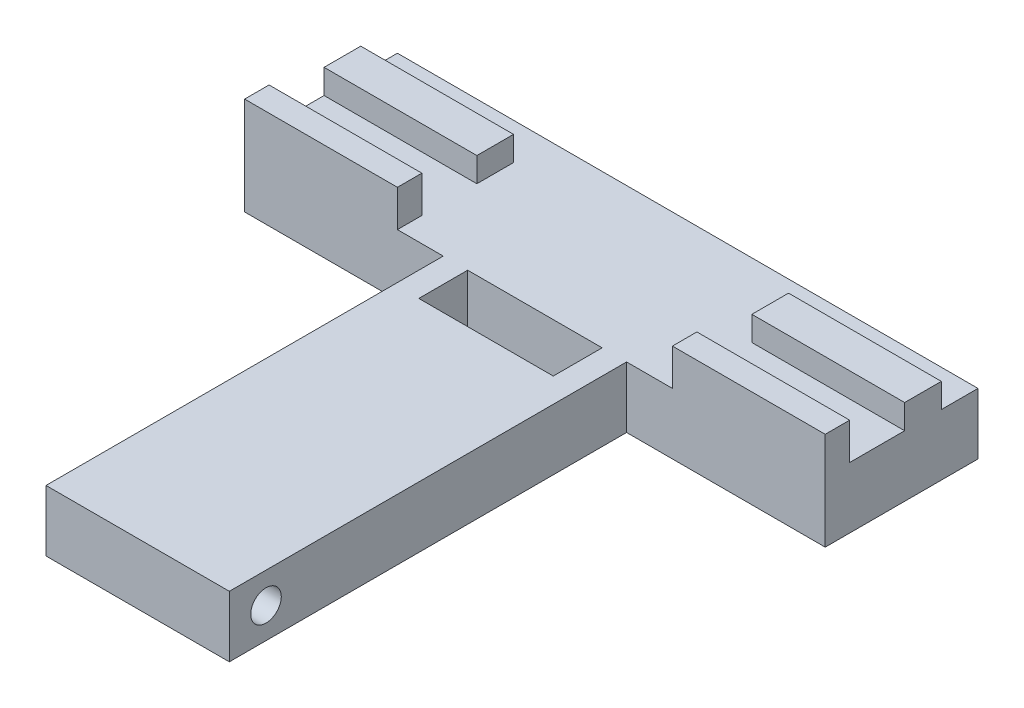
ISO-10303-21;
HEADER;
FILE_DESCRIPTION(('STEP AP214'),'2;1');
FILE_NAME('part.step','',(''),(''),'','','');
FILE_SCHEMA(('AUTOMOTIVE_DESIGN { 1 0 10303 214 1 1 1 1 }'));
ENDSEC;
DATA;
#1=APPLICATION_CONTEXT('core data for automotive mechanical design processes');
#2=APPLICATION_PROTOCOL_DEFINITION('international standard','automotive_design',2000,#1);
#3=PRODUCT_CONTEXT('',#1,'mechanical');
#4=PRODUCT('Part','Part','',(#3));
#5=PRODUCT_RELATED_PRODUCT_CATEGORY('part','',(#4));
#6=PRODUCT_DEFINITION_FORMATION('','',#4);
#7=PRODUCT_DEFINITION_CONTEXT('part definition',#1,'design');
#8=PRODUCT_DEFINITION('design','',#6,#7);
#9=PRODUCT_DEFINITION_SHAPE('','',#8);
#10=(LENGTH_UNIT() NAMED_UNIT(*) SI_UNIT(.MILLI.,.METRE.));
#11=(NAMED_UNIT(*) PLANE_ANGLE_UNIT() SI_UNIT($,.RADIAN.));
#12=(NAMED_UNIT(*) SI_UNIT($,.STERADIAN.) SOLID_ANGLE_UNIT());
#13=UNCERTAINTY_MEASURE_WITH_UNIT(LENGTH_MEASURE(1.E-05),#10,'distance_accuracy_value','');
#14=(GEOMETRIC_REPRESENTATION_CONTEXT(3) GLOBAL_UNCERTAINTY_ASSIGNED_CONTEXT((#13)) GLOBAL_UNIT_ASSIGNED_CONTEXT((#10,
#11,#12)) REPRESENTATION_CONTEXT('',''));
#15=CARTESIAN_POINT('',(0.,0.,0.));
#16=DIRECTION('',(0.,0.,1.));
#17=DIRECTION('',(1.,0.,0.));
#18=AXIS2_PLACEMENT_3D('',#15,#16,#17);
#19=CARTESIAN_POINT('',(2.,5.,-32.5));
#20=DIRECTION('',(0.,0.,-1.));
#21=DIRECTION('',(-1.,0.,0.));
#22=AXIS2_PLACEMENT_3D('',#19,#20,#21);
#23=PLANE('',#22);
#24=DIRECTION('',(1.,0.,0.));
#25=VECTOR('',#24,1.);
#26=CARTESIAN_POINT('',(-16.25,8.,-32.5));
#27=LINE('',#26,#25);
#28=CARTESIAN_POINT('',(18.75,8.,-32.5));
#29=VERTEX_POINT('',#28);
#30=CARTESIAN_POINT('',(31.25,8.,-32.5));
#31=VERTEX_POINT('',#30);
#32=EDGE_CURVE('E242',#29,#31,#27,.T.);
#33=ORIENTED_EDGE('',*,*,#32,.F.);
#34=DIRECTION('',(0.,1.,0.));
#35=VECTOR('',#34,1.);
#36=CARTESIAN_POINT('',(18.75,8.,-32.5));
#37=LINE('',#36,#35);
#38=CARTESIAN_POINT('',(18.75,5.,-32.5));
#39=VERTEX_POINT('',#38);
#40=EDGE_CURVE('E215',#39,#29,#37,.T.);
#41=ORIENTED_EDGE('',*,*,#40,.F.);
#42=DIRECTION('',(1.,0.,0.));
#43=VECTOR('',#42,1.);
#44=CARTESIAN_POINT('',(18.75,5.,-32.5));
#45=LINE('',#44,#43);
#46=CARTESIAN_POINT('',(15.,5.,-32.5));
#47=VERTEX_POINT('',#46);
#48=EDGE_CURVE('E224',#47,#39,#45,.T.);
#49=ORIENTED_EDGE('',*,*,#48,.F.);
#50=DIRECTION('',(0.,1.,0.));
#51=VECTOR('',#50,1.);
#52=CARTESIAN_POINT('',(15.,5.00000000000006,-32.5));
#53=LINE('',#52,#51);
#54=CARTESIAN_POINT('',(15.,0.,-32.5));
#55=VERTEX_POINT('',#54);
#56=EDGE_CURVE('E289',#55,#47,#53,.T.);
#57=ORIENTED_EDGE('',*,*,#56,.F.);
#58=DIRECTION('',(1.,0.,0.));
#59=VECTOR('',#58,1.);
#60=CARTESIAN_POINT('',(-16.25,0.,-32.5));
#61=LINE('',#60,#59);
#62=CARTESIAN_POINT('',(31.25,0.,-32.5));
#63=VERTEX_POINT('',#62);
#64=EDGE_CURVE('E290',#55,#63,#61,.T.);
#65=ORIENTED_EDGE('',*,*,#64,.T.);
#66=DIRECTION('',(0.,-1.,0.));
#67=VECTOR('',#66,1.);
#68=CARTESIAN_POINT('',(31.25,8.,-32.5));
#69=LINE('',#68,#67);
#70=EDGE_CURVE('E274',#31,#63,#69,.T.);
#71=ORIENTED_EDGE('',*,*,#70,.F.);
#72=EDGE_LOOP('',(#33,#41,#49,#57,#65,#71));
#73=FACE_BOUND('',#72,.T.);
#74=ADVANCED_FACE('F33',(#73),#23,.F.);
#75=DIRECTION('',(0.,-1.,0.));
#76=VECTOR('',#75,1.);
#77=CARTESIAN_POINT('',(13.,5.,-32.5));
#78=LINE('',#77,#76);
#79=CARTESIAN_POINT('',(13.,5.,-32.5));
#80=VERTEX_POINT('',#79);
#81=CARTESIAN_POINT('',(13.,0.,-32.5));
#82=VERTEX_POINT('',#81);
#83=EDGE_CURVE('E341',#80,#82,#78,.T.);
#84=ORIENTED_EDGE('',*,*,#83,.F.);
#85=CARTESIAN_POINT('',(2.00000000000001,5.,-32.5));
#86=VERTEX_POINT('',#85);
#87=EDGE_CURVE('E230',#86,#80,#45,.T.);
#88=ORIENTED_EDGE('',*,*,#87,.F.);
#89=DIRECTION('',(0.,-1.,0.));
#90=VECTOR('',#89,1.);
#91=CARTESIAN_POINT('',(2.,5.,-32.5));
#92=LINE('',#91,#90);
#93=CARTESIAN_POINT('',(2.,0.,-32.5));
#94=VERTEX_POINT('',#93);
#95=EDGE_CURVE('E345',#86,#94,#92,.T.);
#96=ORIENTED_EDGE('',*,*,#95,.T.);
#97=DIRECTION('',(-1.,0.,0.));
#98=VECTOR('',#97,1.);
#99=CARTESIAN_POINT('',(0.,0.,-32.5));
#100=LINE('',#99,#98);
#101=EDGE_CURVE('E402',#82,#94,#100,.T.);
#102=ORIENTED_EDGE('',*,*,#101,.F.);
#103=EDGE_LOOP('',(#84,#88,#96,#102));
#104=FACE_BOUND('',#103,.T.);
#105=ADVANCED_FACE('F470',(#104),#23,.F.);
#106=CARTESIAN_POINT('',(-16.25,7.,-39.));
#107=DIRECTION('',(0.,0.,1.));
#108=DIRECTION('',(1.,0.,0.));
#109=AXIS2_PLACEMENT_3D('',#106,#107,#108);
#110=PLANE('',#109);
#111=DIRECTION('',(0.,-1.,0.));
#112=VECTOR('',#111,1.);
#113=CARTESIAN_POINT('',(-3.75000000000001,7.,-39.));
#114=LINE('',#113,#112);
#115=CARTESIAN_POINT('',(-3.75000000000001,7.,-39.));
#116=VERTEX_POINT('',#115);
#117=CARTESIAN_POINT('',(-3.75000000000001,5.,-39.));
#118=VERTEX_POINT('',#117);
#119=EDGE_CURVE('E267',#116,#118,#114,.T.);
#120=ORIENTED_EDGE('',*,*,#119,.F.);
#121=DIRECTION('',(1.,0.,0.));
#122=VECTOR('',#121,1.);
#123=CARTESIAN_POINT('',(-16.25,7.,-39.));
#124=LINE('',#123,#122);
#125=CARTESIAN_POINT('',(-16.25,7.,-39.));
#126=VERTEX_POINT('',#125);
#127=EDGE_CURVE('E316',#126,#116,#124,.T.);
#128=ORIENTED_EDGE('',*,*,#127,.F.);
#129=DIRECTION('',(0.,-1.,0.));
#130=VECTOR('',#129,1.);
#131=CARTESIAN_POINT('',(-16.25,7.,-39.));
#132=LINE('',#131,#130);
#133=CARTESIAN_POINT('',(-16.25,5.,-39.));
#134=VERTEX_POINT('',#133);
#135=EDGE_CURVE('E299',#126,#134,#132,.T.);
#136=ORIENTED_EDGE('',*,*,#135,.T.);
#137=DIRECTION('',(1.,0.,0.));
#138=VECTOR('',#137,1.);
#139=CARTESIAN_POINT('',(-16.25,5.,-39.));
#140=LINE('',#139,#138);
#141=EDGE_CURVE('E329',#134,#118,#140,.T.);
#142=ORIENTED_EDGE('',*,*,#141,.T.);
#143=EDGE_LOOP('',(#120,#128,#136,#142));
#144=FACE_BOUND('',#143,.T.);
#145=ADVANCED_FACE('F455',(#144),#110,.T.);
#146=CARTESIAN_POINT('',(-16.25,7.,-42.));
#147=DIRECTION('',(0.,1.,0.));
#148=DIRECTION('',(0.,0.,1.));
#149=AXIS2_PLACEMENT_3D('',#146,#147,#148);
#150=PLANE('',#149);
#151=DIRECTION('',(0.,0.,1.));
#152=VECTOR('',#151,1.);
#153=CARTESIAN_POINT('',(-3.75000000000001,7.,-42.));
#154=LINE('',#153,#152);
#155=CARTESIAN_POINT('',(-3.75000000000001,7.,-42.));
#156=VERTEX_POINT('',#155);
#157=EDGE_CURVE('E265',#156,#116,#154,.T.);
#158=ORIENTED_EDGE('',*,*,#157,.F.);
#159=DIRECTION('',(1.,0.,0.));
#160=VECTOR('',#159,1.);
#161=CARTESIAN_POINT('',(-16.25,7.,-42.));
#162=LINE('',#161,#160);
#163=CARTESIAN_POINT('',(-16.25,7.,-42.));
#164=VERTEX_POINT('',#163);
#165=EDGE_CURVE('E321',#164,#156,#162,.T.);
#166=ORIENTED_EDGE('',*,*,#165,.F.);
#167=DIRECTION('',(0.,0.,1.));
#168=VECTOR('',#167,1.);
#169=CARTESIAN_POINT('',(-16.25,7.,-42.));
#170=LINE('',#169,#168);
#171=EDGE_CURVE('E305',#164,#126,#170,.T.);
#172=ORIENTED_EDGE('',*,*,#171,.T.);
#173=ORIENTED_EDGE('',*,*,#127,.T.);
#174=EDGE_LOOP('',(#158,#166,#172,#173));
#175=FACE_BOUND('',#174,.T.);
#176=ADVANCED_FACE('F459',(#175),#150,.T.);
#177=CARTESIAN_POINT('',(-16.25,7.,-42.));
#178=DIRECTION('',(0.,0.,-1.));
#179=DIRECTION('',(-1.,0.,0.));
#180=AXIS2_PLACEMENT_3D('',#177,#178,#179);
#181=PLANE('',#180);
#182=DIRECTION('',(0.,1.,0.));
#183=VECTOR('',#182,1.);
#184=CARTESIAN_POINT('',(-3.75000000000001,7.,-42.));
#185=LINE('',#184,#183);
#186=CARTESIAN_POINT('',(-3.75000000000001,5.,-42.));
#187=VERTEX_POINT('',#186);
#188=EDGE_CURVE('E263',#187,#156,#185,.T.);
#189=ORIENTED_EDGE('',*,*,#188,.F.);
#190=DIRECTION('',(1.,0.,0.));
#191=VECTOR('',#190,1.);
#192=CARTESIAN_POINT('',(-16.25,5.,-42.));
#193=LINE('',#192,#191);
#194=CARTESIAN_POINT('',(-16.25,5.,-42.));
#195=VERTEX_POINT('',#194);
#196=EDGE_CURVE('E325',#195,#187,#193,.T.);
#197=ORIENTED_EDGE('',*,*,#196,.F.);
#198=DIRECTION('',(0.,1.,0.));
#199=VECTOR('',#198,1.);
#200=CARTESIAN_POINT('',(-16.25,7.,-42.));
#201=LINE('',#200,#199);
#202=EDGE_CURVE('E301',#195,#164,#201,.T.);
#203=ORIENTED_EDGE('',*,*,#202,.T.);
#204=ORIENTED_EDGE('',*,*,#165,.T.);
#205=EDGE_LOOP('',(#189,#197,#203,#204));
#206=FACE_BOUND('',#205,.T.);
#207=ADVANCED_FACE('F448',(#206),#181,.T.);
#208=CARTESIAN_POINT('',(-16.25,8.,-34.5));
#209=DIRECTION('',(0.,1.,0.));
#210=DIRECTION('',(0.,0.,1.));
#211=AXIS2_PLACEMENT_3D('',#208,#209,#210);
#212=PLANE('',#211);
#213=DIRECTION('',(0.,0.,1.));
#214=VECTOR('',#213,1.);
#215=CARTESIAN_POINT('',(-3.75000000000001,8.,-81.));
#216=LINE('',#215,#214);
#217=CARTESIAN_POINT('',(-3.75000000000001,8.,-34.5));
#218=VERTEX_POINT('',#217);
#219=CARTESIAN_POINT('',(-3.75000000000001,8.,-32.5));
#220=VERTEX_POINT('',#219);
#221=EDGE_CURVE('E221',#218,#220,#216,.T.);
#222=ORIENTED_EDGE('',*,*,#221,.F.);
#223=DIRECTION('',(1.,0.,0.));
#224=VECTOR('',#223,1.);
#225=CARTESIAN_POINT('',(-16.25,8.,-34.5));
#226=LINE('',#225,#224);
#227=CARTESIAN_POINT('',(-16.25,8.,-34.5));
#228=VERTEX_POINT('',#227);
#229=EDGE_CURVE('E293',#228,#218,#226,.T.);
#230=ORIENTED_EDGE('',*,*,#229,.F.);
#231=DIRECTION('',(0.,0.,1.));
#232=VECTOR('',#231,1.);
#233=CARTESIAN_POINT('',(-16.25,8.,-34.5));
#234=LINE('',#233,#232);
#235=CARTESIAN_POINT('',(-16.25,8.,-32.5));
#236=VERTEX_POINT('',#235);
#237=EDGE_CURVE('E273',#228,#236,#234,.T.);
#238=ORIENTED_EDGE('',*,*,#237,.T.);
#239=EDGE_CURVE('E291',#236,#220,#27,.T.);
#240=ORIENTED_EDGE('',*,*,#239,.T.);
#241=EDGE_LOOP('',(#222,#230,#238,#240));
#242=FACE_BOUND('',#241,.T.);
#243=ADVANCED_FACE('F534',(#242),#212,.T.);
#244=CARTESIAN_POINT('',(-16.25,5.,-34.5));
#245=DIRECTION('',(0.,0.,-1.));
#246=DIRECTION('',(-1.,0.,0.));
#247=AXIS2_PLACEMENT_3D('',#244,#245,#246);
#248=PLANE('',#247);
#249=DIRECTION('',(0.,1.,0.));
#250=VECTOR('',#249,1.);
#251=CARTESIAN_POINT('',(-3.75000000000001,5.,-34.5));
#252=LINE('',#251,#250);
#253=CARTESIAN_POINT('',(-3.75000000000001,5.,-34.5));
#254=VERTEX_POINT('',#253);
#255=EDGE_CURVE('E11',#254,#218,#252,.T.);
#256=ORIENTED_EDGE('',*,*,#255,.F.);
#257=DIRECTION('',(-1.,0.,0.));
#258=VECTOR('',#257,1.);
#259=CARTESIAN_POINT('',(0.,5.,-34.5));
#260=LINE('',#259,#258);
#261=CARTESIAN_POINT('',(-16.25,5.,-34.5));
#262=VERTEX_POINT('',#261);
#263=EDGE_CURVE('E211',#254,#262,#260,.T.);
#264=ORIENTED_EDGE('',*,*,#263,.T.);
#265=DIRECTION('',(0.,1.,0.));
#266=VECTOR('',#265,1.);
#267=CARTESIAN_POINT('',(-16.25,5.,-34.5));
#268=LINE('',#267,#266);
#269=EDGE_CURVE('E270',#262,#228,#268,.T.);
#270=ORIENTED_EDGE('',*,*,#269,.T.);
#271=ORIENTED_EDGE('',*,*,#229,.T.);
#272=EDGE_LOOP('',(#256,#264,#270,#271));
#273=FACE_BOUND('',#272,.T.);
#274=ADVANCED_FACE('F518',(#273),#248,.T.);
#275=CARTESIAN_POINT('',(0.,5.,-35.));
#276=DIRECTION('',(1.,0.,0.));
#277=DIRECTION('',(0.,0.,-1.));
#278=AXIS2_PLACEMENT_3D('',#275,#276,#277);
#279=PLANE('',#278);
#280=CARTESIAN_POINT('',(0.,2.5,-3.00000000000001));
#281=DIRECTION('',(1.,0.,0.));
#282=DIRECTION('',(0.,0.,-1.));
#283=AXIS2_PLACEMENT_3D('',#280,#281,#282);
#284=CIRCLE('',#283,1.25);
#285=CARTESIAN_POINT('',(0.,2.5,-4.25000000000001));
#286=VERTEX_POINT('',#285);
#287=EDGE_CURVE('E354',#286,#286,#284,.T.);
#288=ORIENTED_EDGE('',*,*,#287,.T.);
#289=EDGE_LOOP('',(#288));
#290=FACE_BOUND('',#289,.T.);
#291=DIRECTION('',(0.,0.,1.));
#292=VECTOR('',#291,1.);
#293=CARTESIAN_POINT('',(0.,5.,-35.));
#294=LINE('',#293,#292);
#295=CARTESIAN_POINT('',(0.,5.,-32.5));
#296=VERTEX_POINT('',#295);
#297=CARTESIAN_POINT('',(0.,5.,0.));
#298=VERTEX_POINT('',#297);
#299=EDGE_CURVE('E358',#296,#298,#294,.T.);
#300=ORIENTED_EDGE('',*,*,#299,.F.);
#301=DIRECTION('',(0.,-1.,0.));
#302=VECTOR('',#301,1.);
#303=CARTESIAN_POINT('',(0.,5.,-32.5));
#304=LINE('',#303,#302);
#305=CARTESIAN_POINT('',(0.,0.,-32.5));
#306=VERTEX_POINT('',#305);
#307=EDGE_CURVE('E229',#296,#306,#304,.T.);
#308=ORIENTED_EDGE('',*,*,#307,.T.);
#309=DIRECTION('',(0.,0.,1.));
#310=VECTOR('',#309,1.);
#311=CARTESIAN_POINT('',(0.,0.,-35.));
#312=LINE('',#311,#310);
#313=CARTESIAN_POINT('',(0.,0.,0.));
#314=VERTEX_POINT('',#313);
#315=EDGE_CURVE('E357',#306,#314,#312,.T.);
#316=ORIENTED_EDGE('',*,*,#315,.T.);
#317=DIRECTION('',(0.,-1.,0.));
#318=VECTOR('',#317,1.);
#319=CARTESIAN_POINT('',(0.,5.,0.));
#320=LINE('',#319,#318);
#321=EDGE_CURVE('E393',#298,#314,#320,.T.);
#322=ORIENTED_EDGE('',*,*,#321,.F.);
#323=EDGE_LOOP('',(#300,#308,#316,#322));
#324=FACE_BOUND('',#323,.T.);
#325=ADVANCED_FACE('F35',(#290,#324),#279,.F.);
#326=CARTESIAN_POINT('',(0.,5.,0.));
#327=DIRECTION('',(0.,0.,-1.));
#328=DIRECTION('',(-1.,0.,0.));
#329=AXIS2_PLACEMENT_3D('',#326,#327,#328);
#330=PLANE('',#329);
#331=DIRECTION('',(1.,0.,0.));
#332=VECTOR('',#331,1.);
#333=CARTESIAN_POINT('',(0.,0.,0.));
#334=LINE('',#333,#332);
#335=CARTESIAN_POINT('',(15.,0.,0.));
#336=VERTEX_POINT('',#335);
#337=EDGE_CURVE('E376',#314,#336,#334,.T.);
#338=ORIENTED_EDGE('',*,*,#337,.T.);
#339=DIRECTION('',(0.,-1.,0.));
#340=VECTOR('',#339,1.);
#341=CARTESIAN_POINT('',(15.,5.,0.));
#342=LINE('',#341,#340);
#343=CARTESIAN_POINT('',(15.,5.,0.));
#344=VERTEX_POINT('',#343);
#345=EDGE_CURVE('E390',#344,#336,#342,.T.);
#346=ORIENTED_EDGE('',*,*,#345,.F.);
#347=DIRECTION('',(1.,0.,0.));
#348=VECTOR('',#347,1.);
#349=CARTESIAN_POINT('',(0.,5.,0.));
#350=LINE('',#349,#348);
#351=EDGE_CURVE('E360',#298,#344,#350,.T.);
#352=ORIENTED_EDGE('',*,*,#351,.F.);
#353=ORIENTED_EDGE('',*,*,#321,.T.);
#354=EDGE_LOOP('',(#338,#346,#352,#353));
#355=FACE_BOUND('',#354,.T.);
#356=ADVANCED_FACE('F511',(#355),#330,.F.);
#357=CARTESIAN_POINT('',(15.,5.,0.));
#358=DIRECTION('',(-1.,0.,0.));
#359=DIRECTION('',(0.,0.,1.));
#360=AXIS2_PLACEMENT_3D('',#357,#358,#359);
#361=PLANE('',#360);
#362=CARTESIAN_POINT('',(15.,2.5,-3.00000000000001));
#363=DIRECTION('',(1.,0.,0.));
#364=DIRECTION('',(0.,0.,-1.));
#365=AXIS2_PLACEMENT_3D('',#362,#363,#364);
#366=CIRCLE('',#365,1.25);
#367=CARTESIAN_POINT('',(15.,2.5,-4.25000000000001));
#368=VERTEX_POINT('',#367);
#369=EDGE_CURVE('E344',#368,#368,#366,.T.);
#370=ORIENTED_EDGE('',*,*,#369,.F.);
#371=EDGE_LOOP('',(#370));
#372=FACE_BOUND('',#371,.T.);
#373=DIRECTION('',(0.,0.,-1.));
#374=VECTOR('',#373,1.);
#375=CARTESIAN_POINT('',(15.,0.,0.));
#376=LINE('',#375,#374);
#377=EDGE_CURVE('E378',#336,#55,#376,.T.);
#378=ORIENTED_EDGE('',*,*,#377,.T.);
#379=ORIENTED_EDGE('',*,*,#56,.T.);
#380=DIRECTION('',(0.,0.,-1.));
#381=VECTOR('',#380,1.);
#382=CARTESIAN_POINT('',(15.,5.,0.));
#383=LINE('',#382,#381);
#384=EDGE_CURVE('E236',#344,#47,#383,.T.);
#385=ORIENTED_EDGE('',*,*,#384,.F.);
#386=ORIENTED_EDGE('',*,*,#345,.T.);
#387=EDGE_LOOP('',(#378,#379,#385,#386));
#388=FACE_BOUND('',#387,.T.);
#389=ADVANCED_FACE('F509',(#372,#388),#361,.F.);
#390=CARTESIAN_POINT('',(31.25,5.,-45.));
#391=DIRECTION('',(-1.,0.,0.));
#392=DIRECTION('',(0.,0.,1.));
#393=AXIS2_PLACEMENT_3D('',#390,#391,#392);
#394=PLANE('',#393);
#395=DIRECTION('',(0.,0.,-1.));
#396=VECTOR('',#395,1.);
#397=CARTESIAN_POINT('',(31.25,0.,-45.));
#398=LINE('',#397,#396);
#399=CARTESIAN_POINT('',(31.25,0.,-45.));
#400=VERTEX_POINT('',#399);
#401=EDGE_CURVE('E380',#63,#400,#398,.T.);
#402=ORIENTED_EDGE('',*,*,#401,.T.);
#403=DIRECTION('',(0.,-1.,0.));
#404=VECTOR('',#403,1.);
#405=CARTESIAN_POINT('',(31.25,5.,-45.));
#406=LINE('',#405,#404);
#407=CARTESIAN_POINT('',(31.25,5.,-45.));
#408=VERTEX_POINT('',#407);
#409=EDGE_CURVE('E387',#408,#400,#406,.T.);
#410=ORIENTED_EDGE('',*,*,#409,.F.);
#411=DIRECTION('',(0.,0.,-1.));
#412=VECTOR('',#411,1.);
#413=CARTESIAN_POINT('',(31.25,5.,-45.));
#414=LINE('',#413,#412);
#415=CARTESIAN_POINT('',(31.25,5.,-42.));
#416=VERTEX_POINT('',#415);
#417=EDGE_CURVE('E364',#416,#408,#414,.T.);
#418=ORIENTED_EDGE('',*,*,#417,.F.);
#419=DIRECTION('',(0.,1.,0.));
#420=VECTOR('',#419,1.);
#421=CARTESIAN_POINT('',(31.25,7.,-42.));
#422=LINE('',#421,#420);
#423=CARTESIAN_POINT('',(31.25,7.,-42.));
#424=VERTEX_POINT('',#423);
#425=EDGE_CURVE('E311',#416,#424,#422,.T.);
#426=ORIENTED_EDGE('',*,*,#425,.T.);
#427=DIRECTION('',(0.,0.,1.));
#428=VECTOR('',#427,1.);
#429=CARTESIAN_POINT('',(31.25,7.,-42.));
#430=LINE('',#429,#428);
#431=CARTESIAN_POINT('',(31.25,7.,-39.));
#432=VERTEX_POINT('',#431);
#433=EDGE_CURVE('E302',#424,#432,#430,.T.);
#434=ORIENTED_EDGE('',*,*,#433,.T.);
#435=DIRECTION('',(0.,-1.,0.));
#436=VECTOR('',#435,1.);
#437=CARTESIAN_POINT('',(31.25,7.,-39.));
#438=LINE('',#437,#436);
#439=CARTESIAN_POINT('',(31.25,5.,-39.));
#440=VERTEX_POINT('',#439);
#441=EDGE_CURVE('E298',#432,#440,#438,.T.);
#442=ORIENTED_EDGE('',*,*,#441,.T.);
#443=CARTESIAN_POINT('',(31.25,5.,-34.5));
#444=VERTEX_POINT('',#443);
#445=EDGE_CURVE('E365',#444,#440,#414,.T.);
#446=ORIENTED_EDGE('',*,*,#445,.F.);
#447=DIRECTION('',(0.,1.,0.));
#448=VECTOR('',#447,1.);
#449=CARTESIAN_POINT('',(31.25,5.,-34.5));
#450=LINE('',#449,#448);
#451=CARTESIAN_POINT('',(31.25,8.,-34.5));
#452=VERTEX_POINT('',#451);
#453=EDGE_CURVE('E269',#444,#452,#450,.T.);
#454=ORIENTED_EDGE('',*,*,#453,.T.);
#455=DIRECTION('',(0.,0.,1.));
#456=VECTOR('',#455,1.);
#457=CARTESIAN_POINT('',(31.25,8.,-34.5));
#458=LINE('',#457,#456);
#459=EDGE_CURVE('E282',#452,#31,#458,.T.);
#460=ORIENTED_EDGE('',*,*,#459,.T.);
#461=ORIENTED_EDGE('',*,*,#70,.T.);
#462=EDGE_LOOP('',(#402,#410,#418,#426,#434,#442,#446,#454,#460,#461));
#463=FACE_BOUND('',#462,.T.);
#464=ADVANCED_FACE('F414',(#463),#394,.F.);
#465=CARTESIAN_POINT('',(-16.25,5.,-45.));
#466=DIRECTION('',(0.,0.,1.));
#467=DIRECTION('',(1.,0.,0.));
#468=AXIS2_PLACEMENT_3D('',#465,#466,#467);
#469=PLANE('',#468);
#470=DIRECTION('',(-1.,0.,0.));
#471=VECTOR('',#470,1.);
#472=CARTESIAN_POINT('',(-16.25,0.,-45.));
#473=LINE('',#472,#471);
#474=CARTESIAN_POINT('',(-16.25,0.,-45.));
#475=VERTEX_POINT('',#474);
#476=EDGE_CURVE('E382',#400,#475,#473,.T.);
#477=ORIENTED_EDGE('',*,*,#476,.T.);
#478=DIRECTION('',(0.,-1.,0.));
#479=VECTOR('',#478,1.);
#480=CARTESIAN_POINT('',(-16.25,5.,-45.));
#481=LINE('',#480,#479);
#482=CARTESIAN_POINT('',(-16.25,5.,-45.));
#483=VERTEX_POINT('',#482);
#484=EDGE_CURVE('E374',#483,#475,#481,.T.);
#485=ORIENTED_EDGE('',*,*,#484,.F.);
#486=DIRECTION('',(-1.,0.,0.));
#487=VECTOR('',#486,1.);
#488=CARTESIAN_POINT('',(-16.25,5.,-45.));
#489=LINE('',#488,#487);
#490=EDGE_CURVE('E368',#408,#483,#489,.T.);
#491=ORIENTED_EDGE('',*,*,#490,.F.);
#492=ORIENTED_EDGE('',*,*,#409,.T.);
#493=EDGE_LOOP('',(#477,#485,#491,#492));
#494=FACE_BOUND('',#493,.T.);
#495=ADVANCED_FACE('F438',(#494),#469,.F.);
#496=CARTESIAN_POINT('',(-16.25,5.,-35.));
#497=DIRECTION('',(1.,0.,0.));
#498=DIRECTION('',(0.,0.,-1.));
#499=AXIS2_PLACEMENT_3D('',#496,#497,#498);
#500=PLANE('',#499);
#501=DIRECTION('',(0.,0.,1.));
#502=VECTOR('',#501,1.);
#503=CARTESIAN_POINT('',(-16.25,0.,-35.));
#504=LINE('',#503,#502);
#505=CARTESIAN_POINT('',(-16.25,0.,-32.5));
#506=VERTEX_POINT('',#505);
#507=EDGE_CURVE('E361',#475,#506,#504,.T.);
#508=ORIENTED_EDGE('',*,*,#507,.T.);
#509=DIRECTION('',(0.,-1.,0.));
#510=VECTOR('',#509,1.);
#511=CARTESIAN_POINT('',(-16.25,8.,-32.5));
#512=LINE('',#511,#510);
#513=EDGE_CURVE('E277',#236,#506,#512,.T.);
#514=ORIENTED_EDGE('',*,*,#513,.F.);
#515=ORIENTED_EDGE('',*,*,#237,.F.);
#516=ORIENTED_EDGE('',*,*,#269,.F.);
#517=DIRECTION('',(0.,0.,1.));
#518=VECTOR('',#517,1.);
#519=CARTESIAN_POINT('',(-16.25,5.,-35.));
#520=LINE('',#519,#518);
#521=EDGE_CURVE('E370',#134,#262,#520,.T.);
#522=ORIENTED_EDGE('',*,*,#521,.F.);
#523=ORIENTED_EDGE('',*,*,#135,.F.);
#524=ORIENTED_EDGE('',*,*,#171,.F.);
#525=ORIENTED_EDGE('',*,*,#202,.F.);
#526=EDGE_CURVE('E371',#483,#195,#520,.T.);
#527=ORIENTED_EDGE('',*,*,#526,.F.);
#528=ORIENTED_EDGE('',*,*,#484,.T.);
#529=EDGE_LOOP('',(#508,#514,#515,#516,#522,#523,#524,#525,#527,#528));
#530=FACE_BOUND('',#529,.T.);
#531=ADVANCED_FACE('F443',(#530),#500,.F.);
#532=CARTESIAN_POINT('',(0.,5.,0.));
#533=DIRECTION('',(0.,1.,0.));
#534=DIRECTION('',(0.,0.,1.));
#535=AXIS2_PLACEMENT_3D('',#532,#533,#534);
#536=PLANE('',#535);
#537=CARTESIAN_POINT('',(18.75,5.,-39.));
#538=VERTEX_POINT('',#537);
#539=EDGE_CURVE('E308',#538,#440,#140,.T.);
#540=ORIENTED_EDGE('',*,*,#539,.F.);
#541=DIRECTION('',(0.,0.,1.));
#542=VECTOR('',#541,1.);
#543=CARTESIAN_POINT('',(18.75,5.,-81.));
#544=LINE('',#543,#542);
#545=CARTESIAN_POINT('',(18.75,5.,-42.));
#546=VERTEX_POINT('',#545);
#547=EDGE_CURVE('E48',#546,#538,#544,.T.);
#548=ORIENTED_EDGE('',*,*,#547,.F.);
#549=EDGE_CURVE('E328',#546,#416,#193,.T.);
#550=ORIENTED_EDGE('',*,*,#549,.T.);
#551=ORIENTED_EDGE('',*,*,#417,.T.);
#552=ORIENTED_EDGE('',*,*,#490,.T.);
#553=ORIENTED_EDGE('',*,*,#526,.T.);
#554=ORIENTED_EDGE('',*,*,#196,.T.);
#555=DIRECTION('',(0.,0.,1.));
#556=VECTOR('',#555,1.);
#557=CARTESIAN_POINT('',(-3.75000000000001,5.,-81.));
#558=LINE('',#557,#556);
#559=EDGE_CURVE('E214',#187,#118,#558,.T.);
#560=ORIENTED_EDGE('',*,*,#559,.T.);
#561=ORIENTED_EDGE('',*,*,#141,.F.);
#562=ORIENTED_EDGE('',*,*,#521,.T.);
#563=ORIENTED_EDGE('',*,*,#263,.F.);
#564=CARTESIAN_POINT('',(-3.75000000000001,5.,-32.5));
#565=VERTEX_POINT('',#564);
#566=EDGE_CURVE('E203',#254,#565,#558,.T.);
#567=ORIENTED_EDGE('',*,*,#566,.T.);
#568=EDGE_CURVE('E208',#565,#296,#45,.T.);
#569=ORIENTED_EDGE('',*,*,#568,.T.);
#570=ORIENTED_EDGE('',*,*,#299,.T.);
#571=ORIENTED_EDGE('',*,*,#351,.T.);
#572=ORIENTED_EDGE('',*,*,#384,.T.);
#573=ORIENTED_EDGE('',*,*,#48,.T.);
#574=CARTESIAN_POINT('',(18.75,5.,-34.5));
#575=VERTEX_POINT('',#574);
#576=EDGE_CURVE('E55',#575,#39,#544,.T.);
#577=ORIENTED_EDGE('',*,*,#576,.F.);
#578=EDGE_CURVE('E408',#444,#575,#260,.T.);
#579=ORIENTED_EDGE('',*,*,#578,.F.);
#580=ORIENTED_EDGE('',*,*,#445,.T.);
#581=EDGE_LOOP('',(#540,#548,#550,#551,#552,#553,#554,#560,#561,#562,#563,#567,#569,#570,#571,
#572,#573,#577,#579,#580));
#582=FACE_BOUND('',#581,.T.);
#583=DIRECTION('',(0.,0.,-1.));
#584=VECTOR('',#583,1.);
#585=CARTESIAN_POINT('',(2.,5.,-28.5));
#586=LINE('',#585,#584);
#587=CARTESIAN_POINT('',(2.,5.,-28.5));
#588=VERTEX_POINT('',#587);
#589=EDGE_CURVE('E337',#588,#86,#586,.T.);
#590=ORIENTED_EDGE('',*,*,#589,.T.);
#591=ORIENTED_EDGE('',*,*,#87,.T.);
#592=DIRECTION('',(0.,0.,1.));
#593=VECTOR('',#592,1.);
#594=CARTESIAN_POINT('',(13.,5.,-28.5));
#595=LINE('',#594,#593);
#596=CARTESIAN_POINT('',(13.,5.,-28.5));
#597=VERTEX_POINT('',#596);
#598=EDGE_CURVE('E319',#80,#597,#595,.T.);
#599=ORIENTED_EDGE('',*,*,#598,.T.);
#600=DIRECTION('',(-1.,0.,0.));
#601=VECTOR('',#600,1.);
#602=CARTESIAN_POINT('',(2.,5.,-28.5));
#603=LINE('',#602,#601);
#604=EDGE_CURVE('E334',#597,#588,#603,.T.);
#605=ORIENTED_EDGE('',*,*,#604,.T.);
#606=EDGE_LOOP('',(#590,#591,#599,#605));
#607=FACE_BOUND('',#606,.T.);
#608=ADVANCED_FACE('F205',(#582,#607),#536,.T.);
#609=CARTESIAN_POINT('',(0.,0.,0.));
#610=DIRECTION('',(0.,1.,0.));
#611=DIRECTION('',(0.,0.,1.));
#612=AXIS2_PLACEMENT_3D('',#609,#610,#611);
#613=PLANE('',#612);
#614=ORIENTED_EDGE('',*,*,#315,.F.);
#615=EDGE_CURVE('E287',#506,#306,#61,.T.);
#616=ORIENTED_EDGE('',*,*,#615,.F.);
#617=ORIENTED_EDGE('',*,*,#507,.F.);
#618=ORIENTED_EDGE('',*,*,#476,.F.);
#619=ORIENTED_EDGE('',*,*,#401,.F.);
#620=ORIENTED_EDGE('',*,*,#64,.F.);
#621=ORIENTED_EDGE('',*,*,#377,.F.);
#622=ORIENTED_EDGE('',*,*,#337,.F.);
#623=EDGE_LOOP('',(#614,#616,#617,#618,#619,#620,#621,#622));
#624=FACE_BOUND('',#623,.T.);
#625=ORIENTED_EDGE('',*,*,#101,.T.);
#626=DIRECTION('',(0.,0.,1.));
#627=VECTOR('',#626,1.);
#628=CARTESIAN_POINT('',(2.,0.,0.));
#629=LINE('',#628,#627);
#630=CARTESIAN_POINT('',(2.,0.,-28.5));
#631=VERTEX_POINT('',#630);
#632=EDGE_CURVE('E399',#94,#631,#629,.T.);
#633=ORIENTED_EDGE('',*,*,#632,.T.);
#634=DIRECTION('',(1.,0.,0.));
#635=VECTOR('',#634,1.);
#636=CARTESIAN_POINT('',(0.,0.,-28.5));
#637=LINE('',#636,#635);
#638=CARTESIAN_POINT('',(13.,0.,-28.5));
#639=VERTEX_POINT('',#638);
#640=EDGE_CURVE('E396',#631,#639,#637,.T.);
#641=ORIENTED_EDGE('',*,*,#640,.T.);
#642=DIRECTION('',(0.,0.,-1.));
#643=VECTOR('',#642,1.);
#644=CARTESIAN_POINT('',(13.,0.,0.));
#645=LINE('',#644,#643);
#646=EDGE_CURVE('E405',#639,#82,#645,.T.);
#647=ORIENTED_EDGE('',*,*,#646,.T.);
#648=EDGE_LOOP('',(#625,#633,#641,#647));
#649=FACE_BOUND('',#648,.T.);
#650=ADVANCED_FACE('F493',(#624,#649),#613,.F.);
#651=CARTESIAN_POINT('',(-16.25,2.5,-3.00000000000001));
#652=DIRECTION('',(1.,0.,0.));
#653=DIRECTION('',(0.,0.,-1.));
#654=AXIS2_PLACEMENT_3D('',#651,#652,#653);
#655=CYLINDRICAL_SURFACE('',#654,1.25);
#656=ORIENTED_EDGE('',*,*,#369,.T.);
#657=EDGE_LOOP('',(#656));
#658=FACE_BOUND('',#657,.T.);
#659=ORIENTED_EDGE('',*,*,#287,.F.);
#660=EDGE_LOOP('',(#659));
#661=FACE_BOUND('',#660,.T.);
#662=ADVANCED_FACE('F487',(#658,#661),#655,.F.);
#663=CARTESIAN_POINT('',(13.,5.,-28.5));
#664=DIRECTION('',(1.,0.,0.));
#665=DIRECTION('',(0.,0.,-1.));
#666=AXIS2_PLACEMENT_3D('',#663,#664,#665);
#667=PLANE('',#666);
#668=DIRECTION('',(0.,-1.,0.));
#669=VECTOR('',#668,1.);
#670=CARTESIAN_POINT('',(13.,5.,-28.5));
#671=LINE('',#670,#669);
#672=EDGE_CURVE('E340',#597,#639,#671,.T.);
#673=ORIENTED_EDGE('',*,*,#672,.F.);
#674=ORIENTED_EDGE('',*,*,#598,.F.);
#675=ORIENTED_EDGE('',*,*,#83,.T.);
#676=ORIENTED_EDGE('',*,*,#646,.F.);
#677=EDGE_LOOP('',(#673,#674,#675,#676));
#678=FACE_BOUND('',#677,.T.);
#679=ADVANCED_FACE('F480',(#678),#667,.F.);
#680=ORIENTED_EDGE('',*,*,#568,.F.);
#681=DIRECTION('',(0.,-1.,0.));
#682=VECTOR('',#681,1.);
#683=CARTESIAN_POINT('',(-3.75000000000001,8.,-32.5));
#684=LINE('',#683,#682);
#685=EDGE_CURVE('E218',#220,#565,#684,.T.);
#686=ORIENTED_EDGE('',*,*,#685,.F.);
#687=ORIENTED_EDGE('',*,*,#239,.F.);
#688=ORIENTED_EDGE('',*,*,#513,.T.);
#689=ORIENTED_EDGE('',*,*,#615,.T.);
#690=ORIENTED_EDGE('',*,*,#307,.F.);
#691=EDGE_LOOP('',(#680,#686,#687,#688,#689,#690));
#692=FACE_BOUND('',#691,.T.);
#693=ADVANCED_FACE('F227',(#692),#23,.F.);
#694=CARTESIAN_POINT('',(2.,5.,-28.5));
#695=DIRECTION('',(-1.,0.,0.));
#696=DIRECTION('',(0.,0.,1.));
#697=AXIS2_PLACEMENT_3D('',#694,#695,#696);
#698=PLANE('',#697);
#699=ORIENTED_EDGE('',*,*,#95,.F.);
#700=ORIENTED_EDGE('',*,*,#589,.F.);
#701=DIRECTION('',(0.,-1.,0.));
#702=VECTOR('',#701,1.);
#703=CARTESIAN_POINT('',(2.,5.,-28.5));
#704=LINE('',#703,#702);
#705=EDGE_CURVE('E348',#588,#631,#704,.T.);
#706=ORIENTED_EDGE('',*,*,#705,.T.);
#707=ORIENTED_EDGE('',*,*,#632,.F.);
#708=EDGE_LOOP('',(#699,#700,#706,#707));
#709=FACE_BOUND('',#708,.T.);
#710=ADVANCED_FACE('F479',(#709),#698,.F.);
#711=CARTESIAN_POINT('',(2.,5.,-28.5));
#712=DIRECTION('',(0.,0.,1.));
#713=DIRECTION('',(1.,0.,0.));
#714=AXIS2_PLACEMENT_3D('',#711,#712,#713);
#715=PLANE('',#714);
#716=ORIENTED_EDGE('',*,*,#705,.F.);
#717=ORIENTED_EDGE('',*,*,#604,.F.);
#718=ORIENTED_EDGE('',*,*,#672,.T.);
#719=ORIENTED_EDGE('',*,*,#640,.F.);
#720=EDGE_LOOP('',(#716,#717,#718,#719));
#721=FACE_BOUND('',#720,.T.);
#722=ADVANCED_FACE('F485',(#721),#715,.F.);
#723=DIRECTION('',(0.,1.,0.));
#724=VECTOR('',#723,1.);
#725=CARTESIAN_POINT('',(18.75,7.,-39.));
#726=LINE('',#725,#724);
#727=CARTESIAN_POINT('',(18.75,7.,-39.));
#728=VERTEX_POINT('',#727);
#729=EDGE_CURVE('E261',#538,#728,#726,.T.);
#730=ORIENTED_EDGE('',*,*,#729,.F.);
#731=ORIENTED_EDGE('',*,*,#539,.T.);
#732=ORIENTED_EDGE('',*,*,#441,.F.);
#733=EDGE_CURVE('E320',#728,#432,#124,.T.);
#734=ORIENTED_EDGE('',*,*,#733,.F.);
#735=EDGE_LOOP('',(#730,#731,#732,#734));
#736=FACE_BOUND('',#735,.T.);
#737=ADVANCED_FACE('F420',(#736),#110,.T.);
#738=DIRECTION('',(0.,0.,-1.));
#739=VECTOR('',#738,1.);
#740=CARTESIAN_POINT('',(18.75,7.,-42.));
#741=LINE('',#740,#739);
#742=CARTESIAN_POINT('',(18.75,7.,-42.));
#743=VERTEX_POINT('',#742);
#744=EDGE_CURVE('E259',#728,#743,#741,.T.);
#745=ORIENTED_EDGE('',*,*,#744,.F.);
#746=ORIENTED_EDGE('',*,*,#733,.T.);
#747=ORIENTED_EDGE('',*,*,#433,.F.);
#748=EDGE_CURVE('E324',#743,#424,#162,.T.);
#749=ORIENTED_EDGE('',*,*,#748,.F.);
#750=EDGE_LOOP('',(#745,#746,#747,#749));
#751=FACE_BOUND('',#750,.T.);
#752=ADVANCED_FACE('F427',(#751),#150,.T.);
#753=DIRECTION('',(0.,-1.,0.));
#754=VECTOR('',#753,1.);
#755=CARTESIAN_POINT('',(18.75,7.,-42.));
#756=LINE('',#755,#754);
#757=EDGE_CURVE('E254',#743,#546,#756,.T.);
#758=ORIENTED_EDGE('',*,*,#757,.F.);
#759=ORIENTED_EDGE('',*,*,#748,.T.);
#760=ORIENTED_EDGE('',*,*,#425,.F.);
#761=ORIENTED_EDGE('',*,*,#549,.F.);
#762=EDGE_LOOP('',(#758,#759,#760,#761));
#763=FACE_BOUND('',#762,.T.);
#764=ADVANCED_FACE('F430',(#763),#181,.T.);
#765=DIRECTION('',(0.,0.,1.));
#766=VECTOR('',#765,1.);
#767=CARTESIAN_POINT('',(18.75,8.,-81.));
#768=LINE('',#767,#766);
#769=CARTESIAN_POINT('',(18.75,8.,-34.5));
#770=VERTEX_POINT('',#769);
#771=EDGE_CURVE('E246',#770,#29,#768,.T.);
#772=ORIENTED_EDGE('',*,*,#771,.T.);
#773=ORIENTED_EDGE('',*,*,#32,.T.);
#774=ORIENTED_EDGE('',*,*,#459,.F.);
#775=EDGE_CURVE('E252',#770,#452,#226,.T.);
#776=ORIENTED_EDGE('',*,*,#775,.F.);
#777=EDGE_LOOP('',(#772,#773,#774,#776));
#778=FACE_BOUND('',#777,.T.);
#779=ADVANCED_FACE('F250',(#778),#212,.T.);
#780=DIRECTION('',(0.,-1.,0.));
#781=VECTOR('',#780,1.);
#782=CARTESIAN_POINT('',(18.75,5.,-34.5));
#783=LINE('',#782,#781);
#784=EDGE_CURVE('E41',#770,#575,#783,.T.);
#785=ORIENTED_EDGE('',*,*,#784,.F.);
#786=ORIENTED_EDGE('',*,*,#775,.T.);
#787=ORIENTED_EDGE('',*,*,#453,.F.);
#788=ORIENTED_EDGE('',*,*,#578,.T.);
#789=EDGE_LOOP('',(#785,#786,#787,#788));
#790=FACE_BOUND('',#789,.T.);
#791=ADVANCED_FACE('F412',(#790),#248,.T.);
#792=CARTESIAN_POINT('',(18.75,8.,-81.));
#793=DIRECTION('',(1.,0.,0.));
#794=DIRECTION('',(0.,0.,-1.));
#795=AXIS2_PLACEMENT_3D('',#792,#793,#794);
#796=PLANE('',#795);
#797=ORIENTED_EDGE('',*,*,#784,.T.);
#798=ORIENTED_EDGE('',*,*,#576,.T.);
#799=ORIENTED_EDGE('',*,*,#40,.T.);
#800=ORIENTED_EDGE('',*,*,#771,.F.);
#801=EDGE_LOOP('',(#797,#798,#799,#800));
#802=FACE_BOUND('',#801,.T.);
#803=ADVANCED_FACE('F245',(#802),#796,.F.);
#804=CARTESIAN_POINT('',(-3.75000000000001,8.,-81.));
#805=DIRECTION('',(-1.,0.,0.));
#806=DIRECTION('',(0.,-1.,0.));
#807=AXIS2_PLACEMENT_3D('',#804,#805,#806);
#808=PLANE('',#807);
#809=ORIENTED_EDGE('',*,*,#255,.T.);
#810=ORIENTED_EDGE('',*,*,#221,.T.);
#811=ORIENTED_EDGE('',*,*,#685,.T.);
#812=ORIENTED_EDGE('',*,*,#566,.F.);
#813=EDGE_LOOP('',(#809,#810,#811,#812));
#814=FACE_BOUND('',#813,.T.);
#815=ADVANCED_FACE('F219',(#814),#808,.F.);
#816=ORIENTED_EDGE('',*,*,#119,.T.);
#817=ORIENTED_EDGE('',*,*,#559,.F.);
#818=ORIENTED_EDGE('',*,*,#188,.T.);
#819=ORIENTED_EDGE('',*,*,#157,.T.);
#820=EDGE_LOOP('',(#816,#817,#818,#819));
#821=FACE_BOUND('',#820,.T.);
#822=ADVANCED_FACE('F460',(#821),#808,.F.);
#823=ORIENTED_EDGE('',*,*,#729,.T.);
#824=ORIENTED_EDGE('',*,*,#744,.T.);
#825=ORIENTED_EDGE('',*,*,#757,.T.);
#826=ORIENTED_EDGE('',*,*,#547,.T.);
#827=EDGE_LOOP('',(#823,#824,#825,#826));
#828=FACE_BOUND('',#827,.T.);
#829=ADVANCED_FACE('F423',(#828),#796,.F.);
#830=CLOSED_SHELL('',(#74,#105,#145,#176,#207,#243,#274,#325,#356,#389,#464,#495,#531,#608,#650,
#662,#679,#693,#710,#722,#737,#752,#764,#779,#791,#803,#815,#822,#829));
#831=MANIFOLD_SOLID_BREP('B2',#830);
#832=ADVANCED_BREP_SHAPE_REPRESENTATION('',(#18,#831),#14);
#833=SHAPE_DEFINITION_REPRESENTATION(#9,#832);
ENDSEC;
END-ISO-10303-21;
